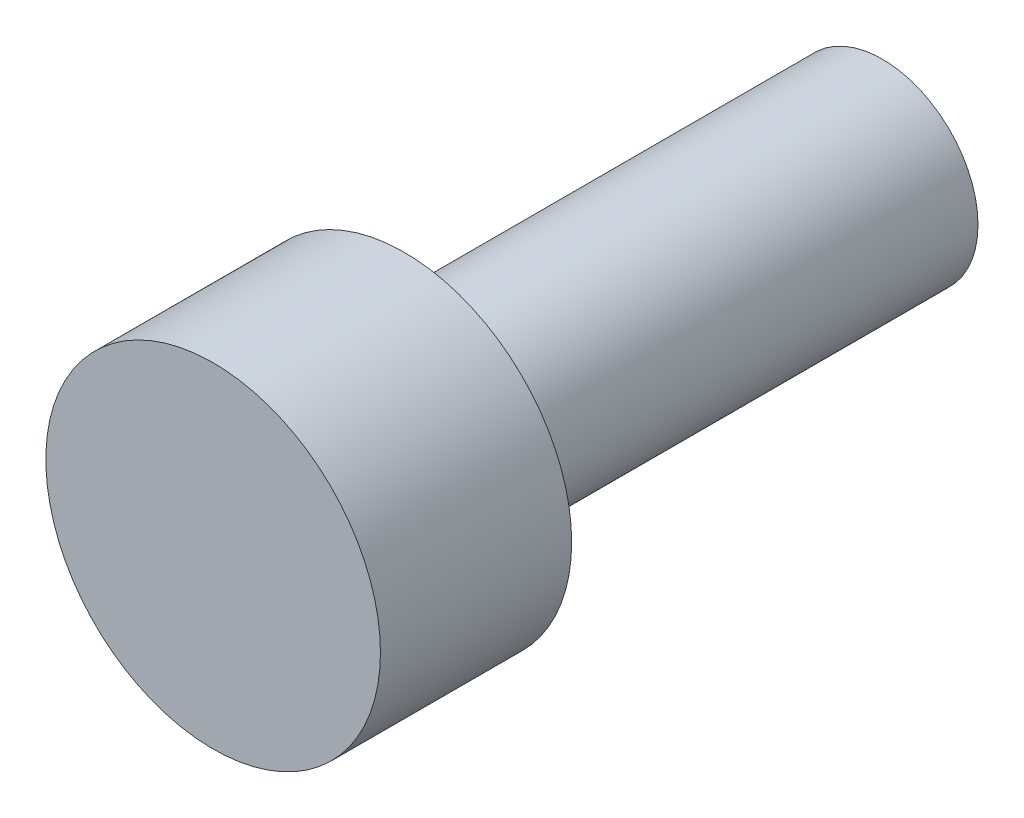
ISO-10303-21;
HEADER;
FILE_DESCRIPTION(('STEP AP214'),'2;1');
FILE_NAME('part.step','',(''),(''),'','','');
FILE_SCHEMA(('AUTOMOTIVE_DESIGN { 1 0 10303 214 1 1 1 1 }'));
ENDSEC;
DATA;
#1=APPLICATION_CONTEXT('core data for automotive mechanical design processes');
#2=APPLICATION_PROTOCOL_DEFINITION('international standard','automotive_design',2000,#1);
#3=PRODUCT_CONTEXT('',#1,'mechanical');
#4=PRODUCT('Part','Part','',(#3));
#5=PRODUCT_RELATED_PRODUCT_CATEGORY('part','',(#4));
#6=PRODUCT_DEFINITION_FORMATION('','',#4);
#7=PRODUCT_DEFINITION_CONTEXT('part definition',#1,'design');
#8=PRODUCT_DEFINITION('design','',#6,#7);
#9=PRODUCT_DEFINITION_SHAPE('','',#8);
#10=(LENGTH_UNIT() NAMED_UNIT(*) SI_UNIT(.MILLI.,.METRE.));
#11=(NAMED_UNIT(*) PLANE_ANGLE_UNIT() SI_UNIT($,.RADIAN.));
#12=(NAMED_UNIT(*) SI_UNIT($,.STERADIAN.) SOLID_ANGLE_UNIT());
#13=UNCERTAINTY_MEASURE_WITH_UNIT(LENGTH_MEASURE(1.E-05),#10,'distance_accuracy_value','');
#14=(GEOMETRIC_REPRESENTATION_CONTEXT(3) GLOBAL_UNCERTAINTY_ASSIGNED_CONTEXT((#13)) GLOBAL_UNIT_ASSIGNED_CONTEXT((#10,
#11,#12)) REPRESENTATION_CONTEXT('',''));
#15=CARTESIAN_POINT('',(0.,0.,0.));
#16=DIRECTION('',(0.,0.,1.));
#17=DIRECTION('',(1.,0.,0.));
#18=AXIS2_PLACEMENT_3D('',#15,#16,#17);
#19=CARTESIAN_POINT('',(0.,0.,0.));
#20=DIRECTION('',(0.,0.,-1.));
#21=DIRECTION('',(-1.,0.,0.));
#22=AXIS2_PLACEMENT_3D('',#19,#20,#21);
#23=CYLINDRICAL_SURFACE('',#22,2.);
#24=CARTESIAN_POINT('',(0.,0.,0.));
#25=DIRECTION('',(0.,0.,1.));
#26=DIRECTION('',(1.,0.,0.));
#27=AXIS2_PLACEMENT_3D('',#24,#25,#26);
#28=CIRCLE('',#27,2.);
#29=CARTESIAN_POINT('',(2.,0.,0.));
#30=VERTEX_POINT('',#29);
#31=EDGE_CURVE('E10',#30,#30,#28,.T.);
#32=ORIENTED_EDGE('',*,*,#31,.F.);
#33=EDGE_LOOP('',(#32));
#34=FACE_BOUND('',#33,.T.);
#35=CARTESIAN_POINT('',(0.,0.,-10.));
#36=DIRECTION('',(0.,0.,1.));
#37=DIRECTION('',(1.,0.,0.));
#38=AXIS2_PLACEMENT_3D('',#35,#36,#37);
#39=CIRCLE('',#38,2.);
#40=CARTESIAN_POINT('',(2.,0.,-10.));
#41=VERTEX_POINT('',#40);
#42=EDGE_CURVE('E44',#41,#41,#39,.T.);
#43=ORIENTED_EDGE('',*,*,#42,.T.);
#44=EDGE_LOOP('',(#43));
#45=FACE_BOUND('',#44,.T.);
#46=ADVANCED_FACE('F41',(#34,#45),#23,.T.);
#47=CARTESIAN_POINT('',(0.,0.,-10.));
#48=DIRECTION('',(0.,0.,1.));
#49=DIRECTION('',(1.,0.,0.));
#50=AXIS2_PLACEMENT_3D('',#47,#48,#49);
#51=PLANE('',#50);
#52=ORIENTED_EDGE('',*,*,#42,.F.);
#53=EDGE_LOOP('',(#52));
#54=FACE_BOUND('',#53,.T.);
#55=ADVANCED_FACE('F64',(#54),#51,.F.);
#56=CARTESIAN_POINT('',(0.,0.,4.));
#57=DIRECTION('',(0.,0.,-1.));
#58=DIRECTION('',(-1.,0.,0.));
#59=AXIS2_PLACEMENT_3D('',#56,#57,#58);
#60=CYLINDRICAL_SURFACE('',#59,3.5);
#61=CARTESIAN_POINT('',(0.,0.,4.));
#62=DIRECTION('',(0.,0.,1.));
#63=DIRECTION('',(1.,0.,0.));
#64=AXIS2_PLACEMENT_3D('',#61,#62,#63);
#65=CIRCLE('',#64,3.5);
#66=CARTESIAN_POINT('',(3.5,0.,4.));
#67=VERTEX_POINT('',#66);
#68=EDGE_CURVE('E51',#67,#67,#65,.T.);
#69=ORIENTED_EDGE('',*,*,#68,.F.);
#70=EDGE_LOOP('',(#69));
#71=FACE_BOUND('',#70,.T.);
#72=CARTESIAN_POINT('',(0.,0.,0.));
#73=DIRECTION('',(0.,0.,1.));
#74=DIRECTION('',(1.,0.,0.));
#75=AXIS2_PLACEMENT_3D('',#72,#73,#74);
#76=CIRCLE('',#75,3.5);
#77=CARTESIAN_POINT('',(3.5,0.,0.));
#78=VERTEX_POINT('',#77);
#79=EDGE_CURVE('E53',#78,#78,#76,.T.);
#80=ORIENTED_EDGE('',*,*,#79,.T.);
#81=EDGE_LOOP('',(#80));
#82=FACE_BOUND('',#81,.T.);
#83=ADVANCED_FACE('F61',(#71,#82),#60,.T.);
#84=CARTESIAN_POINT('',(0.,0.,4.));
#85=DIRECTION('',(0.,0.,1.));
#86=DIRECTION('',(1.,0.,0.));
#87=AXIS2_PLACEMENT_3D('',#84,#85,#86);
#88=PLANE('',#87);
#89=ORIENTED_EDGE('',*,*,#68,.T.);
#90=EDGE_LOOP('',(#89));
#91=FACE_BOUND('',#90,.T.);
#92=ADVANCED_FACE('F59',(#91),#88,.T.);
#93=CARTESIAN_POINT('',(0.,0.,0.));
#94=DIRECTION('',(0.,0.,1.));
#95=DIRECTION('',(1.,0.,0.));
#96=AXIS2_PLACEMENT_3D('',#93,#94,#95);
#97=PLANE('',#96);
#98=ORIENTED_EDGE('',*,*,#31,.T.);
#99=EDGE_LOOP('',(#98));
#100=FACE_BOUND('',#99,.T.);
#101=ORIENTED_EDGE('',*,*,#79,.F.);
#102=EDGE_LOOP('',(#101));
#103=FACE_BOUND('',#102,.T.);
#104=ADVANCED_FACE('F68',(#100,#103),#97,.F.);
#105=CLOSED_SHELL('',(#46,#55,#83,#92,#104));
#106=MANIFOLD_SOLID_BREP('B2',#105);
#107=ADVANCED_BREP_SHAPE_REPRESENTATION('',(#18,#106),#14);
#108=SHAPE_DEFINITION_REPRESENTATION(#9,#107);
ENDSEC;
END-ISO-10303-21;
